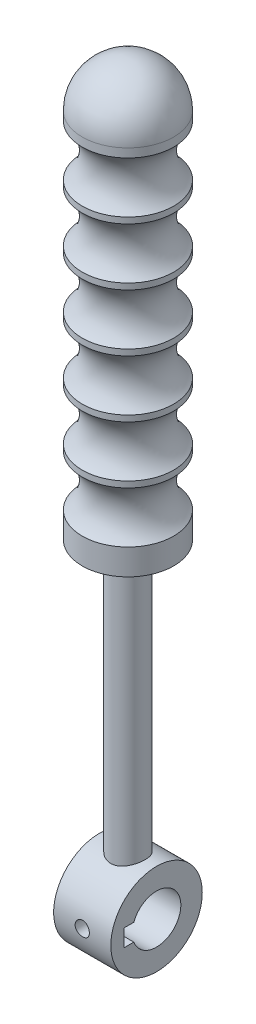
ISO-10303-21;
HEADER;
FILE_DESCRIPTION(('STEP AP214'),'2;1');
FILE_NAME('part.step','',(''),(''),'','','');
FILE_SCHEMA(('AUTOMOTIVE_DESIGN { 1 0 10303 214 1 1 1 1 }'));
ENDSEC;
DATA;
#1=APPLICATION_CONTEXT('core data for automotive mechanical design processes');
#2=APPLICATION_PROTOCOL_DEFINITION('international standard','automotive_design',2000,#1);
#3=PRODUCT_CONTEXT('',#1,'mechanical');
#4=PRODUCT('Part','Part','',(#3));
#5=PRODUCT_RELATED_PRODUCT_CATEGORY('part','',(#4));
#6=PRODUCT_DEFINITION_FORMATION('','',#4);
#7=PRODUCT_DEFINITION_CONTEXT('part definition',#1,'design');
#8=PRODUCT_DEFINITION('design','',#6,#7);
#9=PRODUCT_DEFINITION_SHAPE('','',#8);
#10=(LENGTH_UNIT() NAMED_UNIT(*) SI_UNIT(.MILLI.,.METRE.));
#11=(NAMED_UNIT(*) PLANE_ANGLE_UNIT() SI_UNIT($,.RADIAN.));
#12=(NAMED_UNIT(*) SI_UNIT($,.STERADIAN.) SOLID_ANGLE_UNIT());
#13=UNCERTAINTY_MEASURE_WITH_UNIT(LENGTH_MEASURE(1.E-05),#10,'distance_accuracy_value','');
#14=(GEOMETRIC_REPRESENTATION_CONTEXT(3) GLOBAL_UNCERTAINTY_ASSIGNED_CONTEXT((#13)) GLOBAL_UNIT_ASSIGNED_CONTEXT((#10,
#11,#12)) REPRESENTATION_CONTEXT('',''));
#15=CARTESIAN_POINT('',(0.,0.,0.));
#16=DIRECTION('',(0.,0.,1.));
#17=DIRECTION('',(1.,0.,0.));
#18=AXIS2_PLACEMENT_3D('',#15,#16,#17);
#19=CARTESIAN_POINT('',(0.,128.,0.));
#20=DIRECTION('',(0.,1.,0.));
#21=DIRECTION('',(0.,0.,0.999999999999998));
#22=AXIS2_PLACEMENT_3D('',#19,#20,#21);
#23=CYLINDRICAL_SURFACE('',#22,8.);
#24=CARTESIAN_POINT('',(0.,68.4721359549997,0.));
#25=DIRECTION('',(0.,-1.,0.));
#26=DIRECTION('',(0.,0.,-0.999999999999998));
#27=AXIS2_PLACEMENT_3D('',#24,#25,#26);
#28=CIRCLE('',#27,8.);
#29=CARTESIAN_POINT('',(0.,68.4721359549997,-8.00000000000003));
#30=VERTEX_POINT('',#29);
#31=EDGE_CURVE('E59',#30,#30,#28,.T.);
#32=ORIENTED_EDGE('',*,*,#31,.F.);
#33=EDGE_LOOP('',(#32));
#34=FACE_BOUND('',#33,.T.);
#35=CARTESIAN_POINT('',(0.,69.5278640450004,0.));
#36=DIRECTION('',(0.,1.,0.));
#37=DIRECTION('',(0.,0.,0.999999999999998));
#38=AXIS2_PLACEMENT_3D('',#35,#36,#37);
#39=CIRCLE('',#38,8.);
#40=CARTESIAN_POINT('',(0.,69.5278640450004,7.99999999999997));
#41=VERTEX_POINT('',#40);
#42=EDGE_CURVE('E261',#41,#41,#39,.T.);
#43=ORIENTED_EDGE('',*,*,#42,.F.);
#44=EDGE_LOOP('',(#43));
#45=FACE_BOUND('',#44,.T.);
#46=ADVANCED_FACE('F54',(#34,#45),#23,.T.);
#47=CARTESIAN_POINT('',(0.,78.4721359549996,0.));
#48=DIRECTION('',(0.,-1.,0.));
#49=DIRECTION('',(0.,0.,-0.999999999999998));
#50=AXIS2_PLACEMENT_3D('',#47,#48,#49);
#51=CIRCLE('',#50,8.);
#52=CARTESIAN_POINT('',(0.,78.4721359549996,-8.00000000000005));
#53=VERTEX_POINT('',#52);
#54=EDGE_CURVE('E258',#53,#53,#51,.T.);
#55=ORIENTED_EDGE('',*,*,#54,.F.);
#56=EDGE_LOOP('',(#55));
#57=FACE_BOUND('',#56,.T.);
#58=CARTESIAN_POINT('',(0.,79.5278640450005,-1.11022302462516E-13));
#59=DIRECTION('',(0.,1.,0.));
#60=DIRECTION('',(0.,0.,0.999999999999998));
#61=AXIS2_PLACEMENT_3D('',#58,#59,#60);
#62=CIRCLE('',#61,8.);
#63=CARTESIAN_POINT('',(0.,79.5278640450005,7.99999999999987));
#64=VERTEX_POINT('',#63);
#65=EDGE_CURVE('E255',#64,#64,#62,.T.);
#66=ORIENTED_EDGE('',*,*,#65,.F.);
#67=EDGE_LOOP('',(#66));
#68=FACE_BOUND('',#67,.T.);
#69=ADVANCED_FACE('F178',(#57,#68),#23,.T.);
#70=CARTESIAN_POINT('',(0.,88.4721359549997,-1.2490009027033E-13));
#71=DIRECTION('',(0.,-1.,0.));
#72=DIRECTION('',(0.,0.,-0.999999999999998));
#73=AXIS2_PLACEMENT_3D('',#70,#71,#72);
#74=CIRCLE('',#73,8.);
#75=CARTESIAN_POINT('',(0.,88.4721359549997,-8.00000000000011));
#76=VERTEX_POINT('',#75);
#77=EDGE_CURVE('E253',#76,#76,#74,.T.);
#78=ORIENTED_EDGE('',*,*,#77,.F.);
#79=EDGE_LOOP('',(#78));
#80=FACE_BOUND('',#79,.T.);
#81=CARTESIAN_POINT('',(0.,89.5278640450005,0.));
#82=DIRECTION('',(0.,1.,0.));
#83=DIRECTION('',(0.,0.,0.999999999999998));
#84=AXIS2_PLACEMENT_3D('',#81,#82,#83);
#85=CIRCLE('',#84,8.);
#86=CARTESIAN_POINT('',(0.,89.5278640450005,8.00000000000003));
#87=VERTEX_POINT('',#86);
#88=EDGE_CURVE('E246',#87,#87,#85,.T.);
#89=ORIENTED_EDGE('',*,*,#88,.F.);
#90=EDGE_LOOP('',(#89));
#91=FACE_BOUND('',#90,.T.);
#92=ADVANCED_FACE('F184',(#80,#91),#23,.T.);
#93=CARTESIAN_POINT('',(0.,98.4721359549997,0.));
#94=DIRECTION('',(0.,-1.,0.));
#95=DIRECTION('',(0.,0.,-0.999999999999998));
#96=AXIS2_PLACEMENT_3D('',#93,#94,#95);
#97=CIRCLE('',#96,8.);
#98=CARTESIAN_POINT('',(0.,98.4721359549997,-8.00000000000004));
#99=VERTEX_POINT('',#98);
#100=EDGE_CURVE('E236',#99,#99,#97,.T.);
#101=ORIENTED_EDGE('',*,*,#100,.F.);
#102=EDGE_LOOP('',(#101));
#103=FACE_BOUND('',#102,.T.);
#104=CARTESIAN_POINT('',(0.,99.5278640450006,0.));
#105=DIRECTION('',(0.,1.,0.));
#106=DIRECTION('',(0.,0.,0.999999999999998));
#107=AXIS2_PLACEMENT_3D('',#104,#105,#106);
#108=CIRCLE('',#107,8.);
#109=CARTESIAN_POINT('',(0.,99.5278640450006,7.99999999999993));
#110=VERTEX_POINT('',#109);
#111=EDGE_CURVE('E239',#110,#110,#108,.T.);
#112=ORIENTED_EDGE('',*,*,#111,.F.);
#113=EDGE_LOOP('',(#112));
#114=FACE_BOUND('',#113,.T.);
#115=ADVANCED_FACE('F215',(#103,#114),#23,.T.);
#116=CARTESIAN_POINT('',(0.,104.,0.));
#117=DIRECTION('',(0.,1.,0.));
#118=DIRECTION('',(0.,0.,0.999999999999998));
#119=AXIS2_PLACEMENT_3D('',#116,#117,#118);
#120=TOROIDAL_SURFACE('',#119,12.,6.);
#121=CARTESIAN_POINT('',(0.,108.472135955,0.));
#122=DIRECTION('',(0.,-1.,0.));
#123=DIRECTION('',(0.,0.,-0.999999999999998));
#124=AXIS2_PLACEMENT_3D('',#121,#122,#123);
#125=CIRCLE('',#124,8.);
#126=CARTESIAN_POINT('',(0.,108.472135955,-7.99999999999994));
#127=VERTEX_POINT('',#126);
#128=EDGE_CURVE('E241',#127,#127,#125,.T.);
#129=ORIENTED_EDGE('',*,*,#128,.T.);
#130=EDGE_LOOP('',(#129));
#131=FACE_BOUND('',#130,.T.);
#132=ORIENTED_EDGE('',*,*,#111,.T.);
#133=EDGE_LOOP('',(#132));
#134=FACE_BOUND('',#133,.T.);
#135=ADVANCED_FACE('F208',(#131,#134),#120,.F.);
#136=CARTESIAN_POINT('',(0.,120.,0.));
#137=DIRECTION('',(0.,1.,0.));
#138=DIRECTION('',(0.,0.,-0.999999999999998));
#139=AXIS2_PLACEMENT_3D('',#136,#137,#138);
#140=SPHERICAL_SURFACE('',#139,8.);
#141=CARTESIAN_POINT('',(0.,120.,0.));
#142=DIRECTION('',(0.,1.,0.));
#143=DIRECTION('',(0.,0.,0.999999999999998));
#144=AXIS2_PLACEMENT_3D('',#141,#142,#143);
#145=CIRCLE('',#144,8.);
#146=CARTESIAN_POINT('',(0.,120.,8.00000000000003));
#147=VERTEX_POINT('',#146);
#148=EDGE_CURVE('E136',#147,#147,#145,.T.);
#149=ORIENTED_EDGE('',*,*,#148,.T.);
#150=EDGE_LOOP('',(#149));
#151=FACE_BOUND('',#150,.T.);
#152=ADVANCED_FACE('F163',(#151),#140,.T.);
#153=CARTESIAN_POINT('',(0.,118.472135955,0.));
#154=DIRECTION('',(0.,-1.,0.));
#155=DIRECTION('',(0.,0.,-0.999999999999998));
#156=AXIS2_PLACEMENT_3D('',#153,#154,#155);
#157=CIRCLE('',#156,8.);
#158=CARTESIAN_POINT('',(0.,118.472135955,-8.00000000000007));
#159=VERTEX_POINT('',#158);
#160=EDGE_CURVE('E249',#159,#159,#157,.T.);
#161=ORIENTED_EDGE('',*,*,#160,.F.);
#162=EDGE_LOOP('',(#161));
#163=FACE_BOUND('',#162,.T.);
#164=ORIENTED_EDGE('',*,*,#148,.F.);
#165=EDGE_LOOP('',(#164));
#166=FACE_BOUND('',#165,.T.);
#167=ADVANCED_FACE('F191',(#163,#166),#23,.T.);
#168=CARTESIAN_POINT('',(0.,114.,0.));
#169=DIRECTION('',(0.,1.,0.));
#170=DIRECTION('',(0.,0.,0.999999999999998));
#171=AXIS2_PLACEMENT_3D('',#168,#169,#170);
#172=TOROIDAL_SURFACE('',#171,12.,6.);
#173=ORIENTED_EDGE('',*,*,#160,.T.);
#174=EDGE_LOOP('',(#173));
#175=FACE_BOUND('',#174,.T.);
#176=CARTESIAN_POINT('',(0.,109.527864045,-1.11022302462516E-13));
#177=DIRECTION('',(0.,1.,0.));
#178=DIRECTION('',(0.,0.,0.999999999999998));
#179=AXIS2_PLACEMENT_3D('',#176,#177,#178);
#180=CIRCLE('',#179,8.);
#181=CARTESIAN_POINT('',(0.,109.527864045,7.99999999999987));
#182=VERTEX_POINT('',#181);
#183=EDGE_CURVE('E244',#182,#182,#180,.T.);
#184=ORIENTED_EDGE('',*,*,#183,.T.);
#185=EDGE_LOOP('',(#184));
#186=FACE_BOUND('',#185,.T.);
#187=ADVANCED_FACE('F199',(#175,#186),#172,.F.);
#188=ORIENTED_EDGE('',*,*,#128,.F.);
#189=EDGE_LOOP('',(#188));
#190=FACE_BOUND('',#189,.T.);
#191=ORIENTED_EDGE('',*,*,#183,.F.);
#192=EDGE_LOOP('',(#191));
#193=FACE_BOUND('',#192,.T.);
#194=ADVANCED_FACE('F201',(#190,#193),#23,.T.);
#195=CARTESIAN_POINT('',(0.,94.0000000000001,0.));
#196=DIRECTION('',(0.,1.,0.));
#197=DIRECTION('',(0.,0.,0.999999999999998));
#198=AXIS2_PLACEMENT_3D('',#195,#196,#197);
#199=TOROIDAL_SURFACE('',#198,12.,6.);
#200=ORIENTED_EDGE('',*,*,#100,.T.);
#201=EDGE_LOOP('',(#200));
#202=FACE_BOUND('',#201,.T.);
#203=ORIENTED_EDGE('',*,*,#88,.T.);
#204=EDGE_LOOP('',(#203));
#205=FACE_BOUND('',#204,.T.);
#206=ADVANCED_FACE('F213',(#202,#205),#199,.F.);
#207=CARTESIAN_POINT('',(0.,84.0000000000001,0.));
#208=DIRECTION('',(0.,1.,0.));
#209=DIRECTION('',(0.,0.,0.999999999999998));
#210=AXIS2_PLACEMENT_3D('',#207,#208,#209);
#211=TOROIDAL_SURFACE('',#210,12.,6.);
#212=ORIENTED_EDGE('',*,*,#77,.T.);
#213=EDGE_LOOP('',(#212));
#214=FACE_BOUND('',#213,.T.);
#215=ORIENTED_EDGE('',*,*,#65,.T.);
#216=EDGE_LOOP('',(#215));
#217=FACE_BOUND('',#216,.T.);
#218=ADVANCED_FACE('F219',(#214,#217),#211,.F.);
#219=CARTESIAN_POINT('',(0.,74.0000000000001,0.));
#220=DIRECTION('',(0.,1.,0.));
#221=DIRECTION('',(0.,0.,0.999999999999998));
#222=AXIS2_PLACEMENT_3D('',#219,#220,#221);
#223=TOROIDAL_SURFACE('',#222,12.,6.);
#224=ORIENTED_EDGE('',*,*,#54,.T.);
#225=EDGE_LOOP('',(#224));
#226=FACE_BOUND('',#225,.T.);
#227=ORIENTED_EDGE('',*,*,#42,.T.);
#228=EDGE_LOOP('',(#227));
#229=FACE_BOUND('',#228,.T.);
#230=ADVANCED_FACE('F272',(#226,#229),#223,.F.);
#231=CARTESIAN_POINT('',(0.,64.0000000000001,0.));
#232=DIRECTION('',(0.,1.,0.));
#233=DIRECTION('',(0.,0.,0.999999999999998));
#234=AXIS2_PLACEMENT_3D('',#231,#232,#233);
#235=TOROIDAL_SURFACE('',#234,12.,6.);
#236=ORIENTED_EDGE('',*,*,#31,.T.);
#237=EDGE_LOOP('',(#236));
#238=FACE_BOUND('',#237,.T.);
#239=CARTESIAN_POINT('',(0.,59.5278640450005,0.));
#240=DIRECTION('',(0.,1.,0.));
#241=DIRECTION('',(0.,0.,0.999999999999998));
#242=AXIS2_PLACEMENT_3D('',#239,#240,#241);
#243=CIRCLE('',#242,8.);
#244=CARTESIAN_POINT('',(0.,59.5278640450005,7.99999999999996));
#245=VERTEX_POINT('',#244);
#246=EDGE_CURVE('E265',#245,#245,#243,.T.);
#247=ORIENTED_EDGE('',*,*,#246,.T.);
#248=EDGE_LOOP('',(#247));
#249=FACE_BOUND('',#248,.T.);
#250=ADVANCED_FACE('F270',(#238,#249),#235,.F.);
#251=CARTESIAN_POINT('',(-7.99999999999991,-1.50000000000004,5.64999999999992));
#252=DIRECTION('',(0.,-1.,0.));
#253=DIRECTION('',(0.,0.,-0.999999999999998));
#254=AXIS2_PLACEMENT_3D('',#251,#252,#253);
#255=PLANE('',#254);
#256=DIRECTION('',(0.999999999999997,0.,0.));
#257=VECTOR('',#256,1.);
#258=CARTESIAN_POINT('',(-7.99999999999991,-1.50000000000004,5.64999999999992));
#259=LINE('',#258,#257);
#260=CARTESIAN_POINT('',(-4.99999999999996,-1.50000000000004,5.64999999999992));
#261=VERTEX_POINT('',#260);
#262=CARTESIAN_POINT('',(5.,-1.50000000000004,5.64999999999992));
#263=VERTEX_POINT('',#262);
#264=EDGE_CURVE('E98',#261,#263,#259,.T.);
#265=ORIENTED_EDGE('',*,*,#264,.T.);
#266=DIRECTION('',(0.,0.,-0.999999999999998));
#267=VECTOR('',#266,1.);
#268=CARTESIAN_POINT('',(5.,-1.50000000000004,5.64999999999992));
#269=LINE('',#268,#267);
#270=CARTESIAN_POINT('',(5.,-1.5000000000001,3.97649343014671));
#271=VERTEX_POINT('',#270);
#272=EDGE_CURVE('E72',#263,#271,#269,.T.);
#273=ORIENTED_EDGE('',*,*,#272,.T.);
#274=DIRECTION('',(0.999999999999997,0.,0.));
#275=VECTOR('',#274,1.);
#276=CARTESIAN_POINT('',(5.,-1.5000000000001,3.97649343014671));
#277=LINE('',#276,#275);
#278=CARTESIAN_POINT('',(-4.99999999999996,-1.5000000000001,3.97649343014671));
#279=VERTEX_POINT('',#278);
#280=EDGE_CURVE('E154',#279,#271,#277,.T.);
#281=ORIENTED_EDGE('',*,*,#280,.F.);
#282=DIRECTION('',(0.,0.,-0.999999999999998));
#283=VECTOR('',#282,1.);
#284=CARTESIAN_POINT('',(-4.99999999999996,-1.5,0.));
#285=LINE('',#284,#283);
#286=EDGE_CURVE('E102',#261,#279,#285,.T.);
#287=ORIENTED_EDGE('',*,*,#286,.F.);
#288=EDGE_LOOP('',(#265,#273,#281,#287));
#289=FACE_BOUND('',#288,.T.);
#290=ADVANCED_FACE('F100',(#289),#255,.F.);
#291=CARTESIAN_POINT('',(5.,0.,0.));
#292=DIRECTION('',(0.999999999999997,0.,0.));
#293=DIRECTION('',(0.,0.,-0.999999999999998));
#294=AXIS2_PLACEMENT_3D('',#291,#292,#293);
#295=CYLINDRICAL_SURFACE('',#294,4.25);
#296=CARTESIAN_POINT('',(5.,0.,0.));
#297=DIRECTION('',(0.999999999999997,0.,0.));
#298=DIRECTION('',(0.,0.,-0.999999999999998));
#299=AXIS2_PLACEMENT_3D('',#296,#297,#298);
#300=CIRCLE('',#299,4.25);
#301=CARTESIAN_POINT('',(5.,1.49999999999995,3.97649343014662));
#302=VERTEX_POINT('',#301);
#303=EDGE_CURVE('E119',#271,#302,#300,.T.);
#304=ORIENTED_EDGE('',*,*,#303,.T.);
#305=DIRECTION('',(0.999999999999997,0.,0.));
#306=VECTOR('',#305,1.);
#307=CARTESIAN_POINT('',(5.,1.49999999999995,3.97649343014662));
#308=LINE('',#307,#306);
#309=CARTESIAN_POINT('',(-4.99999999999996,1.49999999999996,3.9764934301466));
#310=VERTEX_POINT('',#309);
#311=EDGE_CURVE('E64',#302,#310,#308,.F.);
#312=ORIENTED_EDGE('',*,*,#311,.T.);
#313=CARTESIAN_POINT('',(-4.99999999999996,0.,0.));
#314=DIRECTION('',(0.999999999999997,0.,0.));
#315=DIRECTION('',(0.,0.,-0.999999999999998));
#316=AXIS2_PLACEMENT_3D('',#313,#314,#315);
#317=CIRCLE('',#316,4.25);
#318=EDGE_CURVE('E129',#279,#310,#317,.T.);
#319=ORIENTED_EDGE('',*,*,#318,.F.);
#320=ORIENTED_EDGE('',*,*,#280,.T.);
#321=EDGE_LOOP('',(#304,#312,#319,#320));
#322=FACE_BOUND('',#321,.T.);
#323=ADVANCED_FACE('F278',(#322),#295,.F.);
#324=CARTESIAN_POINT('',(-7.99999999999991,1.49999999999997,5.64999999999992));
#325=DIRECTION('',(0.,1.,0.));
#326=DIRECTION('',(0.,0.,0.999999999999998));
#327=AXIS2_PLACEMENT_3D('',#324,#325,#326);
#328=PLANE('',#327);
#329=ORIENTED_EDGE('',*,*,#311,.F.);
#330=DIRECTION('',(0.,0.,0.999999999999998));
#331=VECTOR('',#330,1.);
#332=CARTESIAN_POINT('',(5.,1.49999999999995,5.64999999999995));
#333=LINE('',#332,#331);
#334=CARTESIAN_POINT('',(5.,1.49999999999995,5.64999999999995));
#335=VERTEX_POINT('',#334);
#336=EDGE_CURVE('E105',#302,#335,#333,.T.);
#337=ORIENTED_EDGE('',*,*,#336,.T.);
#338=DIRECTION('',(0.999999999999997,0.,0.));
#339=VECTOR('',#338,1.);
#340=CARTESIAN_POINT('',(-7.99999999999991,1.49999999999997,5.64999999999992));
#341=LINE('',#340,#339);
#342=CARTESIAN_POINT('',(-4.99999999999996,1.49999999999997,5.64999999999992));
#343=VERTEX_POINT('',#342);
#344=EDGE_CURVE('E104',#343,#335,#341,.T.);
#345=ORIENTED_EDGE('',*,*,#344,.F.);
#346=DIRECTION('',(0.,0.,0.999999999999998));
#347=VECTOR('',#346,1.);
#348=CARTESIAN_POINT('',(-4.99999999999996,1.49999999999997,0.));
#349=LINE('',#348,#347);
#350=EDGE_CURVE('E80',#310,#343,#349,.T.);
#351=ORIENTED_EDGE('',*,*,#350,.F.);
#352=EDGE_LOOP('',(#329,#337,#345,#351));
#353=FACE_BOUND('',#352,.T.);
#354=ADVANCED_FACE('F173',(#353),#328,.F.);
#355=CARTESIAN_POINT('',(-7.99999999999991,1.49999999999997,5.64999999999992));
#356=DIRECTION('',(0.,0.,0.999999999999998));
#357=DIRECTION('',(0.999999999999997,0.,0.));
#358=AXIS2_PLACEMENT_3D('',#355,#356,#357);
#359=PLANE('',#358);
#360=CARTESIAN_POINT('',(0.,0.,5.64999999999989));
#361=DIRECTION('',(0.,0.,0.999999999999998));
#362=DIRECTION('',(0.999999999999997,0.,0.));
#363=AXIS2_PLACEMENT_3D('',#360,#361,#362);
#364=CIRCLE('',#363,1.24999999999999);
#365=CARTESIAN_POINT('',(1.24999999999999,0.,5.64999999999989));
#366=VERTEX_POINT('',#365);
#367=EDGE_CURVE('E113',#366,#366,#364,.T.);
#368=ORIENTED_EDGE('',*,*,#367,.T.);
#369=EDGE_LOOP('',(#368));
#370=FACE_BOUND('',#369,.T.);
#371=ORIENTED_EDGE('',*,*,#344,.T.);
#372=DIRECTION('',(0.,-1.,0.));
#373=VECTOR('',#372,1.);
#374=CARTESIAN_POINT('',(5.,1.49999999999995,5.64999999999995));
#375=LINE('',#374,#373);
#376=EDGE_CURVE('E108',#335,#263,#375,.T.);
#377=ORIENTED_EDGE('',*,*,#376,.T.);
#378=ORIENTED_EDGE('',*,*,#264,.F.);
#379=DIRECTION('',(0.,-1.,0.));
#380=VECTOR('',#379,1.);
#381=CARTESIAN_POINT('',(-4.99999999999996,0.,5.64999999999997));
#382=LINE('',#381,#380);
#383=EDGE_CURVE('E13',#343,#261,#382,.T.);
#384=ORIENTED_EDGE('',*,*,#383,.F.);
#385=EDGE_LOOP('',(#371,#377,#378,#384));
#386=FACE_BOUND('',#385,.T.);
#387=ADVANCED_FACE('F109',(#370,#386),#359,.F.);
#388=CARTESIAN_POINT('',(-4.99999999999996,0.,0.));
#389=DIRECTION('',(0.999999999999997,0.,0.));
#390=DIRECTION('',(0.,0.,-0.999999999999998));
#391=AXIS2_PLACEMENT_3D('',#388,#389,#390);
#392=PLANE('',#391);
#393=ORIENTED_EDGE('',*,*,#318,.T.);
#394=ORIENTED_EDGE('',*,*,#350,.T.);
#395=ORIENTED_EDGE('',*,*,#383,.T.);
#396=ORIENTED_EDGE('',*,*,#286,.T.);
#397=EDGE_LOOP('',(#393,#394,#395,#396));
#398=FACE_BOUND('',#397,.T.);
#399=CARTESIAN_POINT('',(-4.99999999999996,0.,0.));
#400=DIRECTION('',(0.999999999999997,0.,0.));
#401=DIRECTION('',(0.,0.,-0.999999999999998));
#402=AXIS2_PLACEMENT_3D('',#399,#400,#401);
#403=CIRCLE('',#402,8.);
#404=CARTESIAN_POINT('',(-4.99999999999996,0.,-7.99999999999998));
#405=VERTEX_POINT('',#404);
#406=EDGE_CURVE('E144',#405,#405,#403,.T.);
#407=ORIENTED_EDGE('',*,*,#406,.F.);
#408=EDGE_LOOP('',(#407));
#409=FACE_BOUND('',#408,.T.);
#410=ADVANCED_FACE('F167',(#398,#409),#392,.F.);
#411=CARTESIAN_POINT('',(5.,0.,0.));
#412=DIRECTION('',(0.999999999999997,0.,0.));
#413=DIRECTION('',(0.,0.,-0.999999999999998));
#414=AXIS2_PLACEMENT_3D('',#411,#412,#413);
#415=PLANE('',#414);
#416=ORIENTED_EDGE('',*,*,#336,.F.);
#417=ORIENTED_EDGE('',*,*,#303,.F.);
#418=ORIENTED_EDGE('',*,*,#272,.F.);
#419=ORIENTED_EDGE('',*,*,#376,.F.);
#420=EDGE_LOOP('',(#416,#417,#418,#419));
#421=FACE_BOUND('',#420,.T.);
#422=CARTESIAN_POINT('',(5.,0.,0.));
#423=DIRECTION('',(0.999999999999997,0.,0.));
#424=DIRECTION('',(0.,0.,-0.999999999999998));
#425=AXIS2_PLACEMENT_3D('',#422,#423,#424);
#426=CIRCLE('',#425,8.);
#427=CARTESIAN_POINT('',(5.,0.,-7.99999999999998));
#428=VERTEX_POINT('',#427);
#429=EDGE_CURVE('E140',#428,#428,#426,.T.);
#430=ORIENTED_EDGE('',*,*,#429,.T.);
#431=EDGE_LOOP('',(#430));
#432=FACE_BOUND('',#431,.T.);
#433=ADVANCED_FACE('F116',(#421,#432),#415,.T.);
#434=CARTESIAN_POINT('',(0.,0.,0.));
#435=DIRECTION('',(0.,0.,-0.999999999999998));
#436=DIRECTION('',(-0.999999999999997,0.,0.));
#437=AXIS2_PLACEMENT_3D('',#434,#435,#436);
#438=CYLINDRICAL_SURFACE('',#437,1.24999999999999);
#439=CARTESIAN_POINT('',(1.24999999999999,0.,7.99999999999987));
#440=CARTESIAN_POINT('',(1.24999715086423,-0.0697575486356105,7.99999885097226));
#441=CARTESIAN_POINT('',(1.2441409431132,-0.139554702432941,7.99907806242868));
#442=CARTESIAN_POINT('',(1.2208781543616,-0.277195657489133,7.99549349048798));
#443=CARTESIAN_POINT('',(1.20346055374824,-0.345037530661738,7.99282804422353));
#444=CARTESIAN_POINT('',(1.15761016859668,-0.476756269023764,7.98605348582879));
#445=CARTESIAN_POINT('',(1.12918595931916,-0.540636176144999,7.98194549781585));
#446=CARTESIAN_POINT('',(1.06215072742916,-0.662710625522346,7.97273897019078));
#447=CARTESIAN_POINT('',(1.02354102848203,-0.720905905184214,7.9676405593127));
#448=CARTESIAN_POINT('',(0.936883475823008,-0.830459955825855,7.95697134207171));
#449=CARTESIAN_POINT('',(0.888766502554817,-0.881763739571339,7.95139725696167));
#450=CARTESIAN_POINT('',(0.784609025865502,-0.975603844114178,7.94043038065143));
#451=CARTESIAN_POINT('',(0.728568051349899,-1.0181396432711,7.93503760025369));
#452=CARTESIAN_POINT('',(0.609780864328141,-1.09345272164453,7.92501214063718));
#453=CARTESIAN_POINT('',(0.547000258819065,-1.12617636778998,7.92038369893053));
#454=CARTESIAN_POINT('',(0.41674929457105,-1.18059340798532,7.91245600871182));
#455=CARTESIAN_POINT('',(0.349279213744705,-1.20228745505039,7.909156681511));
#456=CARTESIAN_POINT('',(0.212144549428115,-1.2338577966109,7.9042931725551));
#457=CARTESIAN_POINT('',(0.142502207090597,-1.24382852743746,7.9027151326618));
#458=CARTESIAN_POINT('',(0.00251640555366696,-1.25196184878811,7.90143085535889));
#459=CARTESIAN_POINT('',(-0.0678270097330282,-1.25012517430242,7.9017245014401));
#460=CARTESIAN_POINT('',(-0.20654851592633,-1.23477290404455,7.90413775227601));
#461=CARTESIAN_POINT('',(-0.274938611676543,-1.22136281479848,7.90624086092473));
#462=CARTESIAN_POINT('',(-0.408486003179637,-1.18340968916875,7.91201028172736));
#463=CARTESIAN_POINT('',(-0.473643200320269,-1.15886631342072,7.91567664153204));
#464=CARTESIAN_POINT('',(-0.599194356338568,-1.09923458474699,7.92417753427309));
#465=CARTESIAN_POINT('',(-0.65956689588649,-1.06410186157777,7.92901696543623));
#466=CARTESIAN_POINT('',(-0.773599767842726,-0.984320290733204,7.93931523075047));
#467=CARTESIAN_POINT('',(-0.827259622443729,-0.939670766265148,7.94477410894097));
#468=CARTESIAN_POINT('',(-0.926955123316651,-0.841545444111749,7.9557689312444));
#469=CARTESIAN_POINT('',(-0.972901579134683,-0.787979002802752,7.96130506817794));
#470=CARTESIAN_POINT('',(-1.0551665728199,-0.673848473689727,7.97177562673914));
#471=CARTESIAN_POINT('',(-1.0914850617784,-0.613284350340726,7.97671004531008));
#472=CARTESIAN_POINT('',(-1.15346903671119,-0.486797963528327,7.98542699513515));
#473=CARTESIAN_POINT('',(-1.17912727926647,-0.420872093120307,7.98920874270969));
#474=CARTESIAN_POINT('',(-1.21898298372358,-0.285574767348462,7.99518780000336));
#475=CARTESIAN_POINT('',(-1.23318128703323,-0.216203565343692,7.99738522604476));
#476=CARTESIAN_POINT('',(-1.2495946382251,-0.0767541683819652,7.99993255863628));
#477=CARTESIAN_POINT('',(-1.25193223948809,-0.0066907307544446,8.00030135896431));
#478=CARTESIAN_POINT('',(-1.244883647332,0.132827273205729,7.99920143245634));
#479=CARTESIAN_POINT('',(-1.23549784870543,0.202281859962484,7.99773276749809));
#480=CARTESIAN_POINT('',(-1.20537080615991,0.338236723132774,7.99313461846597));
#481=CARTESIAN_POINT('',(-1.18468962086615,0.404750631027959,7.9900139210769));
#482=CARTESIAN_POINT('',(-1.13262245280062,0.533367033928258,7.98246037841782));
#483=CARTESIAN_POINT('',(-1.10123593077866,0.595469306519639,7.97802746705034));
#484=CARTESIAN_POINT('',(-1.02836400443671,0.714036101125152,7.96829486370469));
#485=CARTESIAN_POINT('',(-0.986801289954789,0.770452561891834,7.96298864331712));
#486=CARTESIAN_POINT('',(-0.894863957046129,0.875553482538978,7.95211940232217));
#487=CARTESIAN_POINT('',(-0.844488780397565,0.92423745223499,7.94655636546331));
#488=CARTESIAN_POINT('',(-0.735809401391391,1.01294040388337,7.93574013768318));
#489=CARTESIAN_POINT('',(-0.677437576438867,1.05287699292062,7.93049020595401));
#490=CARTESIAN_POINT('',(-0.554741963169367,1.12237783863316,7.92095346402915));
#491=CARTESIAN_POINT('',(-0.490418346255261,1.15194239389039,7.91666662610995));
#492=CARTESIAN_POINT('',(-0.357885179642894,1.19973385972486,7.90956535676174));
#493=CARTESIAN_POINT('',(-0.289691265617203,1.21800327473956,7.90674541174479));
#494=CARTESIAN_POINT('',(-0.151155428168035,1.24282061020266,7.90288285140398));
#495=CARTESIAN_POINT('',(-0.0808136672905075,1.24936941542485,7.90184010192219));
#496=CARTESIAN_POINT('',(0.0591993579537489,1.25053726345364,7.90165529022441));
#497=CARTESIAN_POINT('',(0.128869548466771,1.2452859027421,7.9024925802145));
#498=CARTESIAN_POINT('',(0.266322648572152,1.22328111627951,7.90592849470916));
#499=CARTESIAN_POINT('',(0.334105562250849,1.20652771543473,7.90852711539977));
#500=CARTESIAN_POINT('',(0.465818913320262,1.16204164945917,7.91518544427454));
#501=CARTESIAN_POINT('',(0.529752739129238,1.13431880869288,7.91924384476705));
#502=CARTESIAN_POINT('',(0.652082806838164,1.06869384273206,7.92836592023698));
#503=CARTESIAN_POINT('',(0.710478829144209,1.03079131410433,7.93342963505413));
#504=CARTESIAN_POINT('',(0.820732772063398,0.945415040695285,7.94405784046131));
#505=CARTESIAN_POINT('',(0.872516098306927,0.897845535473785,7.94962700580145));
#506=CARTESIAN_POINT('',(0.967410618193386,0.794687973191024,7.96060021820366));
#507=CARTESIAN_POINT('',(1.01051979929594,0.73909806039217,7.9660042267006));
#508=CARTESIAN_POINT('',(1.08707561151577,0.621083429421718,7.97607551228349));
#509=CARTESIAN_POINT('',(1.1204626863798,0.558619686071198,7.98073817215135));
#510=CARTESIAN_POINT('',(1.17622049809646,0.428925941178884,7.9887562991944));
#511=CARTESIAN_POINT('',(1.19860248627918,0.361700888290862,7.99211310071056));
#512=CARTESIAN_POINT('',(1.22671651054529,0.245157119955758,7.99638722932439));
#513=CARTESIAN_POINT('',(1.2354342453145,0.196552787825763,7.99773495813063));
#514=CARTESIAN_POINT('',(1.24707695668954,0.0986388989252183,7.99954174348808));
#515=CARTESIAN_POINT('',(1.25000201477867,0.0493293520844739,8.00000081253971));
#516=CARTESIAN_POINT('',(1.24999999999999,0.,7.99999999999987));
#517=B_SPLINE_CURVE_WITH_KNOTS('',3,(#439,#440,#441,#442,#443,#444,#445,#446,#447,#448,#449,
#450,#451,#452,#453,#454,#455,#456,#457,#458,#459,#460,#461,#462,#463,#464,#465,#466,#467,#468,
#469,#470,#471,#472,#473,#474,#475,#476,#477,#478,#479,#480,#481,#482,#483,#484,#485,#486,#487,
#488,#489,#490,#491,#492,#493,#494,#495,#496,#497,#498,#499,#500,#501,#502,#503,#504,#505,#506,
#507,#508,#509,#510,#511,#512,#513,#514,#515,#516),.UNSPECIFIED.,.T.,.F.,(4,2,2,2,2,2,2,2,2,2,2,
2,2,2,2,2,2,2,2,2,2,2,2,2,2,2,2,2,2,2,2,2,2,2,2,2,2,2,4),(0.,0.209092370238734,
0.418384321263981,0.627513539720471,0.836615593960096,1.04729784076097,1.2579926182271,
1.46981889302876,1.68163262504614,1.89172815567491,2.10181060835265,2.30999788011282,
2.51819149825517,2.72726988701164,2.93636314946023,3.14772866167172,3.35909524756903,
3.5706052187727,3.78209965914919,3.99140427002944,4.20070183264166,4.40889722378273,
4.61710310371006,4.82694270734825,5.03679560800697,5.24854740124785,5.46029309824479,
5.67123705197554,5.88216508114638,6.09078790799336,6.29941028309438,6.507846234833,
6.71629044835666,6.92691006157759,7.13757848571133,7.34951152099906,7.56122742828127,
7.70909008175761,7.85695065529349),.UNSPECIFIED.);
#518=CARTESIAN_POINT('',(1.24999999999999,0.,7.99999999999987));
#519=VERTEX_POINT('',#518);
#520=EDGE_CURVE('E293',#519,#519,#517,.T.);
#521=ORIENTED_EDGE('',*,*,#520,.F.);
#522=EDGE_LOOP('',(#521));
#523=FACE_BOUND('',#522,.T.);
#524=ORIENTED_EDGE('',*,*,#367,.F.);
#525=EDGE_LOOP('',(#524));
#526=FACE_BOUND('',#525,.T.);
#527=ADVANCED_FACE('F166',(#523,#526),#438,.F.);
#528=CARTESIAN_POINT('',(5.,0.,0.));
#529=DIRECTION('',(-0.999999999999997,0.,0.));
#530=DIRECTION('',(0.,0.,0.999999999999998));
#531=AXIS2_PLACEMENT_3D('',#528,#529,#530);
#532=CYLINDRICAL_SURFACE('',#531,8.);
#533=ORIENTED_EDGE('',*,*,#520,.T.);
#534=EDGE_LOOP('',(#533));
#535=FACE_BOUND('',#534,.T.);
#536=ORIENTED_EDGE('',*,*,#429,.F.);
#537=EDGE_LOOP('',(#536));
#538=FACE_BOUND('',#537,.T.);
#539=ORIENTED_EDGE('',*,*,#406,.T.);
#540=EDGE_LOOP('',(#539));
#541=FACE_BOUND('',#540,.T.);
#542=CARTESIAN_POINT('',(0.,7.41619848709564,-3.00000000000009));
#543=CARTESIAN_POINT('',(-0.162014967483384,7.41619281215224,-3.00000608211294));
#544=CARTESIAN_POINT('',(-0.323989845126148,7.42156520296318,-2.98683195095352));
#545=CARTESIAN_POINT('',(-0.643056165935194,7.44232318425771,-2.93472375787469));
#546=CARTESIAN_POINT('',(-0.800147755211701,7.45770847484803,-2.89579046745935));
#547=CARTESIAN_POINT('',(-1.10475074318881,7.4965096061089,-2.79379315222301));
#548=CARTESIAN_POINT('',(-1.25228411329181,7.51990619151701,-2.73078694532994));
#549=CARTESIAN_POINT('',(-1.53474379364786,7.57206268400021,-2.58263713485074));
#550=CARTESIAN_POINT('',(-1.66966630056786,7.60082420131038,-2.49748688189993));
#551=CARTESIAN_POINT('',(-1.92978062324269,7.66207149335186,-2.30293322748416));
#552=CARTESIAN_POINT('',(-2.05425705925786,7.69466683848219,-2.19260762426629));
#553=CARTESIAN_POINT('',(-2.28344562934363,7.75899501256085,-1.95279167955755));
#554=CARTESIAN_POINT('',(-2.38815354748392,7.79072765629291,-1.82329726051334));
#555=CARTESIAN_POINT('',(-2.57827902459101,7.85105747873386,-1.54338931035535));
#556=CARTESIAN_POINT('',(-2.66291894943152,7.87951122447088,-1.39241389507608));
#557=CARTESIAN_POINT('',(-2.80530234504974,7.92876015947619,-1.07711154393044));
#558=CARTESIAN_POINT('',(-2.86305514398395,7.94955800433986,-0.91278926186706));
#559=CARTESIAN_POINT('',(-2.94751579154922,7.98037394206889,-0.58297868335369));
#560=CARTESIAN_POINT('',(-2.97545525488081,7.99081830429548,-0.417846394563214));
#561=CARTESIAN_POINT('',(-3.00344240188986,8.00128028215881,-0.084928727589599));
#562=CARTESIAN_POINT('',(-3.00349915523738,8.00130128829817,0.082855770125628));
#563=CARTESIAN_POINT('',(-2.97643647706969,7.99118531807771,0.407487086128864));
#564=CARTESIAN_POINT('',(-2.9506614041024,7.98155083993308,0.564464356533675));
#565=CARTESIAN_POINT('',(-2.87492816954877,7.95386549864585,0.871678435968747));
#566=CARTESIAN_POINT('',(-2.82496829547564,7.93581403951371,1.02191476686069));
#567=CARTESIAN_POINT('',(-2.7016590966486,7.89275538334828,1.31397803460598));
#568=CARTESIAN_POINT('',(-2.62797998946422,7.86765078939304,1.45565078457394));
#569=CARTESIAN_POINT('',(-2.45961580614019,7.8130262045141,1.72497321591572));
#570=CARTESIAN_POINT('',(-2.36492395396095,7.78350479028854,1.85261835386699));
#571=CARTESIAN_POINT('',(-2.1507454274377,7.72105059308264,2.0981809735993));
#572=CARTESIAN_POINT('',(-2.03013216871475,7.68801927514871,2.21509229051723));
#573=CARTESIAN_POINT('',(-1.77081401334138,7.62364921304341,2.42740791139658));
#574=CARTESIAN_POINT('',(-1.63210458676857,7.59231089545919,2.52280681389436));
#575=CARTESIAN_POINT('',(-1.33656106512263,7.5342540695114,2.69131223613199));
#576=CARTESIAN_POINT('',(-1.17939301282858,7.50765354114231,2.76387695690682));
#577=CARTESIAN_POINT('',(-0.853807549872281,7.4634487707231,2.88112928869856));
#578=CARTESIAN_POINT('',(-0.685396456874305,7.44583952363152,2.92583241207697));
#579=CARTESIAN_POINT('',(-0.3520480753245,7.42279194491539,2.98380383422379));
#580=CARTESIAN_POINT('',(-0.187431788916052,7.41673570495333,2.99867042318758));
#581=CARTESIAN_POINT('',(0.142018713471825,7.41573079037766,3.00115771271741));
#582=CARTESIAN_POINT('',(0.306852864701873,7.42077934004757,2.98878522187307));
#583=CARTESIAN_POINT('',(0.623859844578289,7.44078763262524,2.93859467040515));
#584=CARTESIAN_POINT('',(0.776262271530167,7.45526552433713,2.90201236668517));
#585=CARTESIAN_POINT('',(1.07269588943966,7.49192974091897,2.80599549281233));
#586=CARTESIAN_POINT('',(1.21672535833604,7.51411764500115,2.74655624069226));
#587=CARTESIAN_POINT('',(1.49832887615265,7.56472486232386,2.60400584550564));
#588=CARTESIAN_POINT('',(1.63545858427485,7.59334657784189,2.52009090354107));
#589=CARTESIAN_POINT('',(1.89425796345213,7.65325628588516,2.33182635724966));
#590=CARTESIAN_POINT('',(2.01592194924925,7.6845452518813,2.22746927392867));
#591=CARTESIAN_POINT('',(2.24833674639023,7.7486609310638,1.99345468180183));
#592=CARTESIAN_POINT('',(2.35790681753765,7.78145938714058,1.86261268298218));
#593=CARTESIAN_POINT('',(2.55367673517901,7.84299749926599,1.58359494350636));
#594=CARTESIAN_POINT('',(2.63987650589168,7.87173714215326,1.43541914664531));
#595=CARTESIAN_POINT('',(2.78589211239922,7.92189971409103,1.12603265893687));
#596=CARTESIAN_POINT('',(2.84579824758534,7.9433476267602,0.964868866129222));
#597=CARTESIAN_POINT('',(2.93731282769998,7.97658873425143,0.633763775046502));
#598=CARTESIAN_POINT('',(2.96893457084481,7.98838646598826,0.46382664144715));
#599=CARTESIAN_POINT('',(3.00154880550964,8.00056814634148,0.130671170547573));
#600=CARTESIAN_POINT('',(3.00421896611806,8.00157721907529,-0.0323615361217449));
#601=CARTESIAN_POINT('',(2.98316968110931,7.99369779618446,-0.356453572824894));
#602=CARTESIAN_POINT('',(2.95945341822831,7.98481049426257,-0.517513138490557));
#603=CARTESIAN_POINT('',(2.88748229701274,7.95842179207537,-0.829096496754307));
#604=CARTESIAN_POINT('',(2.83984018824329,7.94113582756029,-0.97978146213774));
#605=CARTESIAN_POINT('',(2.7219799732313,7.89975567241983,-1.27103094601288));
#606=CARTESIAN_POINT('',(2.65175759339053,7.87566019311339,-1.41159354255119));
#607=CARTESIAN_POINT('',(2.48737211299036,7.82181236600124,-1.6850803539889));
#608=CARTESIAN_POINT('',(2.39232671897163,7.79186480217585,-1.81743509769374));
#609=CARTESIAN_POINT('',(2.18238433962478,7.72999015389758,-2.06483469504678));
#610=CARTESIAN_POINT('',(2.06748026838437,7.69806236548312,-2.17987334251191));
#611=CARTESIAN_POINT('',(1.81387173670975,7.63376259478071,-2.39562428472389));
#612=CARTESIAN_POINT('',(1.67423119569086,7.60145610697265,-2.49525999632028));
#613=CARTESIAN_POINT('',(1.37916826085375,7.54196650008333,-2.66969419113704));
#614=CARTESIAN_POINT('',(1.22374423189475,7.51478391266376,-2.74449009756391));
#615=CARTESIAN_POINT('',(0.894088638047402,7.46804539702397,-2.8693177394845));
#616=CARTESIAN_POINT('',(0.71933126696956,7.44887606566005,-2.91812005798755));
#617=CARTESIAN_POINT('',(0.363029456095222,7.42295988688342,-2.9834471344443));
#618=CARTESIAN_POINT('',(0.181489574605547,7.41620484418153,-2.99999318680195));
#619=CARTESIAN_POINT('',(0.,7.41619848709564,-3.00000000000009));
#620=B_SPLINE_CURVE_WITH_KNOTS('',3,(#542,#543,#544,#545,#546,#547,#548,#549,#550,#551,#552,
#553,#554,#555,#556,#557,#558,#559,#560,#561,#562,#563,#564,#565,#566,#567,#568,#569,#570,#571,
#572,#573,#574,#575,#576,#577,#578,#579,#580,#581,#582,#583,#584,#585,#586,#587,#588,#589,#590,
#591,#592,#593,#594,#595,#596,#597,#598,#599,#600,#601,#602,#603,#604,#605,#606,#607,#608,#609,
#610,#611,#612,#613,#614,#615,#616,#617,#618,#619),.UNSPECIFIED.,.T.,.F.,(4,2,2,2,2,2,2,2,2,2,2,
2,2,2,2,2,2,2,2,2,2,2,2,2,2,2,2,2,2,2,2,2,2,2,2,2,2,2,4),(0.,0.485369082889284,
0.970723629307644,1.45491971362398,1.93926135947577,2.44549304813243,2.9518325765695,
3.47540144283828,3.99878852773648,4.49960036990342,5.00024930820694,5.47612945617367,
5.9520433053765,6.43488262432317,6.91787787268933,7.42913350142729,7.94051735665648,
8.46325184520819,8.98569503290578,9.479313155006,9.972807907974,10.4428769187603,
10.9130422687869,11.4008312203128,11.8887989695235,12.4077003400689,12.9266033932,
13.4437101779998,13.960573711399,14.4473144111952,14.933996406586,15.4088054802743,
15.8837044704531,16.3785664737362,16.8736054180957,17.394771991038,17.9159926110813,
18.460063577615,19.0037752466575),.UNSPECIFIED.);
#621=CARTESIAN_POINT('',(0.,7.41619848709564,-3.00000000000009));
#622=VERTEX_POINT('',#621);
#623=EDGE_CURVE('E143',#622,#622,#620,.T.);
#624=ORIENTED_EDGE('',*,*,#623,.F.);
#625=EDGE_LOOP('',(#624));
#626=FACE_BOUND('',#625,.T.);
#627=ADVANCED_FACE('F56',(#535,#538,#541,#626),#532,.T.);
#628=CARTESIAN_POINT('',(0.,120.,0.));
#629=DIRECTION('',(0.,-1.,0.));
#630=DIRECTION('',(0.,0.,-0.999999999999998));
#631=AXIS2_PLACEMENT_3D('',#628,#629,#630);
#632=CYLINDRICAL_SURFACE('',#631,3.);
#633=CARTESIAN_POINT('',(0.,55.,0.));
#634=DIRECTION('',(0.,-1.,0.));
#635=DIRECTION('',(0.,0.,-0.999999999999998));
#636=AXIS2_PLACEMENT_3D('',#633,#634,#635);
#637=CIRCLE('',#636,3.);
#638=CARTESIAN_POINT('',(0.,55.,-3.00000000000001));
#639=VERTEX_POINT('',#638);
#640=EDGE_CURVE('E139',#639,#639,#637,.T.);
#641=ORIENTED_EDGE('',*,*,#640,.T.);
#642=EDGE_LOOP('',(#641));
#643=FACE_BOUND('',#642,.T.);
#644=ORIENTED_EDGE('',*,*,#623,.T.);
#645=EDGE_LOOP('',(#644));
#646=FACE_BOUND('',#645,.T.);
#647=ADVANCED_FACE('F156',(#643,#646),#632,.T.);
#648=CARTESIAN_POINT('',(0.,55.,0.));
#649=DIRECTION('',(0.,-1.,0.));
#650=DIRECTION('',(0.,0.,-0.999999999999998));
#651=AXIS2_PLACEMENT_3D('',#648,#649,#650);
#652=PLANE('',#651);
#653=CARTESIAN_POINT('',(0.,55.,0.));
#654=DIRECTION('',(0.,1.,0.));
#655=DIRECTION('',(0.,0.,0.999999999999998));
#656=AXIS2_PLACEMENT_3D('',#653,#654,#655);
#657=CIRCLE('',#656,8.);
#658=CARTESIAN_POINT('',(0.,55.,7.99999999999996));
#659=VERTEX_POINT('',#658);
#660=EDGE_CURVE('E133',#659,#659,#657,.T.);
#661=ORIENTED_EDGE('',*,*,#660,.F.);
#662=EDGE_LOOP('',(#661));
#663=FACE_BOUND('',#662,.T.);
#664=ORIENTED_EDGE('',*,*,#640,.F.);
#665=EDGE_LOOP('',(#664));
#666=FACE_BOUND('',#665,.T.);
#667=ADVANCED_FACE('F161',(#663,#666),#652,.T.);
#668=ORIENTED_EDGE('',*,*,#246,.F.);
#669=EDGE_LOOP('',(#668));
#670=FACE_BOUND('',#669,.T.);
#671=ORIENTED_EDGE('',*,*,#660,.T.);
#672=EDGE_LOOP('',(#671));
#673=FACE_BOUND('',#672,.T.);
#674=ADVANCED_FACE('F180',(#670,#673),#23,.T.);
#675=CLOSED_SHELL('',(#46,#69,#92,#115,#135,#152,#167,#187,#194,#206,#218,#230,#250,#290,#323,
#354,#387,#410,#433,#527,#627,#647,#667,#674));
#676=MANIFOLD_SOLID_BREP('B2',#675);
#677=ADVANCED_BREP_SHAPE_REPRESENTATION('',(#18,#676),#14);
#678=SHAPE_DEFINITION_REPRESENTATION(#9,#677);
ENDSEC;
END-ISO-10303-21;
